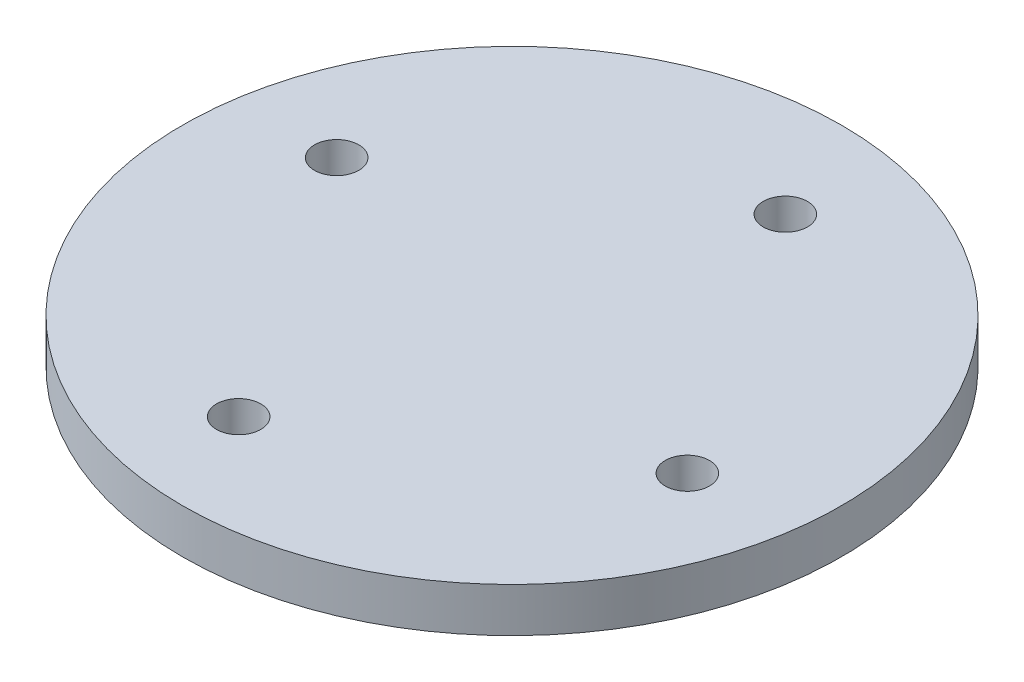
ISO-10303-21;
HEADER;
FILE_DESCRIPTION(('STEP AP214'),'2;1');
FILE_NAME('part.step','',(''),(''),'','','');
FILE_SCHEMA(('AUTOMOTIVE_DESIGN { 1 0 10303 214 1 1 1 1 }'));
ENDSEC;
DATA;
#1=APPLICATION_CONTEXT('core data for automotive mechanical design processes');
#2=APPLICATION_PROTOCOL_DEFINITION('international standard','automotive_design',2000,#1);
#3=PRODUCT_CONTEXT('',#1,'mechanical');
#4=PRODUCT('Part','Part','',(#3));
#5=PRODUCT_RELATED_PRODUCT_CATEGORY('part','',(#4));
#6=PRODUCT_DEFINITION_FORMATION('','',#4);
#7=PRODUCT_DEFINITION_CONTEXT('part definition',#1,'design');
#8=PRODUCT_DEFINITION('design','',#6,#7);
#9=PRODUCT_DEFINITION_SHAPE('','',#8);
#10=(LENGTH_UNIT() NAMED_UNIT(*) SI_UNIT(.MILLI.,.METRE.));
#11=(NAMED_UNIT(*) PLANE_ANGLE_UNIT() SI_UNIT($,.RADIAN.));
#12=(NAMED_UNIT(*) SI_UNIT($,.STERADIAN.) SOLID_ANGLE_UNIT());
#13=UNCERTAINTY_MEASURE_WITH_UNIT(LENGTH_MEASURE(1.E-05),#10,'distance_accuracy_value','');
#14=(GEOMETRIC_REPRESENTATION_CONTEXT(3) GLOBAL_UNCERTAINTY_ASSIGNED_CONTEXT((#13)) GLOBAL_UNIT_ASSIGNED_CONTEXT((#10,
#11,#12)) REPRESENTATION_CONTEXT('',''));
#15=CARTESIAN_POINT('',(0.,0.,0.));
#16=DIRECTION('',(0.,0.,1.));
#17=DIRECTION('',(1.,0.,0.));
#18=AXIS2_PLACEMENT_3D('',#15,#16,#17);
#19=CARTESIAN_POINT('',(-2.21163747918878,2.,10.1262966903329));
#20=DIRECTION('',(0.,-1.,0.));
#21=DIRECTION('',(0.,0.,-1.));
#22=AXIS2_PLACEMENT_3D('',#19,#20,#21);
#23=CYLINDRICAL_SURFACE('',#22,1.);
#24=CARTESIAN_POINT('',(-2.21163747918878,2.,10.1262966903329));
#25=DIRECTION('',(0.,1.,0.));
#26=DIRECTION('',(0.,0.,1.));
#27=AXIS2_PLACEMENT_3D('',#24,#25,#26);
#28=CIRCLE('',#27,1.);
#29=CARTESIAN_POINT('',(-2.21163747918878,2.,11.1262966903329));
#30=VERTEX_POINT('',#29);
#31=EDGE_CURVE('E54',#30,#30,#28,.T.);
#32=ORIENTED_EDGE('',*,*,#31,.T.);
#33=EDGE_LOOP('',(#32));
#34=FACE_BOUND('',#33,.T.);
#35=CARTESIAN_POINT('',(-2.21163747918878,0.,10.1262966903329));
#36=DIRECTION('',(0.,1.,0.));
#37=DIRECTION('',(0.,0.,1.));
#38=AXIS2_PLACEMENT_3D('',#35,#36,#37);
#39=CIRCLE('',#38,1.);
#40=CARTESIAN_POINT('',(-2.21163747918878,0.,11.1262966903329));
#41=VERTEX_POINT('',#40);
#42=EDGE_CURVE('E75',#41,#41,#39,.T.);
#43=ORIENTED_EDGE('',*,*,#42,.F.);
#44=EDGE_LOOP('',(#43));
#45=FACE_BOUND('',#44,.T.);
#46=ADVANCED_FACE('F45',(#34,#45),#23,.F.);
#47=CARTESIAN_POINT('',(10.1262966903329,2.,2.21163747918874));
#48=DIRECTION('',(0.,-1.,0.));
#49=DIRECTION('',(0.,0.,-1.));
#50=AXIS2_PLACEMENT_3D('',#47,#48,#49);
#51=CYLINDRICAL_SURFACE('',#50,1.);
#52=CARTESIAN_POINT('',(10.1262966903329,2.,2.21163747918874));
#53=DIRECTION('',(0.,1.,0.));
#54=DIRECTION('',(0.,0.,1.));
#55=AXIS2_PLACEMENT_3D('',#52,#53,#54);
#56=CIRCLE('',#55,1.);
#57=CARTESIAN_POINT('',(10.1262966903329,2.,3.21163747918874));
#58=VERTEX_POINT('',#57);
#59=EDGE_CURVE('E60',#58,#58,#56,.T.);
#60=ORIENTED_EDGE('',*,*,#59,.T.);
#61=EDGE_LOOP('',(#60));
#62=FACE_BOUND('',#61,.T.);
#63=CARTESIAN_POINT('',(10.1262966903329,0.,2.21163747918874));
#64=DIRECTION('',(0.,1.,0.));
#65=DIRECTION('',(0.,0.,1.));
#66=AXIS2_PLACEMENT_3D('',#63,#64,#65);
#67=CIRCLE('',#66,1.);
#68=CARTESIAN_POINT('',(10.1262966903329,0.,3.21163747918874));
#69=VERTEX_POINT('',#68);
#70=EDGE_CURVE('E72',#69,#69,#67,.T.);
#71=ORIENTED_EDGE('',*,*,#70,.F.);
#72=EDGE_LOOP('',(#71));
#73=FACE_BOUND('',#72,.T.);
#74=ADVANCED_FACE('F98',(#62,#73),#51,.F.);
#75=CARTESIAN_POINT('',(2.21163747918871,2.,-10.1262966903329));
#76=DIRECTION('',(0.,-1.,0.));
#77=DIRECTION('',(0.,0.,-1.));
#78=AXIS2_PLACEMENT_3D('',#75,#76,#77);
#79=CYLINDRICAL_SURFACE('',#78,1.);
#80=CARTESIAN_POINT('',(2.21163747918871,2.,-10.1262966903329));
#81=DIRECTION('',(0.,1.,0.));
#82=DIRECTION('',(0.,0.,1.));
#83=AXIS2_PLACEMENT_3D('',#80,#81,#82);
#84=CIRCLE('',#83,1.);
#85=CARTESIAN_POINT('',(2.21163747918871,2.,-9.12629669033294));
#86=VERTEX_POINT('',#85);
#87=EDGE_CURVE('E87',#86,#86,#84,.T.);
#88=ORIENTED_EDGE('',*,*,#87,.T.);
#89=EDGE_LOOP('',(#88));
#90=FACE_BOUND('',#89,.T.);
#91=CARTESIAN_POINT('',(2.21163747918871,0.,-10.1262966903329));
#92=DIRECTION('',(0.,1.,0.));
#93=DIRECTION('',(0.,0.,1.));
#94=AXIS2_PLACEMENT_3D('',#91,#92,#93);
#95=CIRCLE('',#94,1.);
#96=CARTESIAN_POINT('',(2.21163747918871,0.,-9.12629669033294));
#97=VERTEX_POINT('',#96);
#98=EDGE_CURVE('E68',#97,#97,#95,.T.);
#99=ORIENTED_EDGE('',*,*,#98,.F.);
#100=EDGE_LOOP('',(#99));
#101=FACE_BOUND('',#100,.T.);
#102=ADVANCED_FACE('F116',(#90,#101),#79,.F.);
#103=CARTESIAN_POINT('',(-10.1262966903329,2.,-2.21163747918881));
#104=DIRECTION('',(0.,-1.,0.));
#105=DIRECTION('',(0.,0.,-1.));
#106=AXIS2_PLACEMENT_3D('',#103,#104,#105);
#107=CYLINDRICAL_SURFACE('',#106,1.);
#108=CARTESIAN_POINT('',(-10.1262966903329,2.,-2.21163747918881));
#109=DIRECTION('',(0.,1.,0.));
#110=DIRECTION('',(0.,0.,1.));
#111=AXIS2_PLACEMENT_3D('',#108,#109,#110);
#112=CIRCLE('',#111,1.);
#113=CARTESIAN_POINT('',(-10.1262966903329,2.,-1.21163747918881));
#114=VERTEX_POINT('',#113);
#115=EDGE_CURVE('E82',#114,#114,#112,.T.);
#116=ORIENTED_EDGE('',*,*,#115,.T.);
#117=EDGE_LOOP('',(#116));
#118=FACE_BOUND('',#117,.T.);
#119=CARTESIAN_POINT('',(-10.1262966903329,0.,-2.21163747918881));
#120=DIRECTION('',(0.,1.,0.));
#121=DIRECTION('',(0.,0.,1.));
#122=AXIS2_PLACEMENT_3D('',#119,#120,#121);
#123=CIRCLE('',#122,1.);
#124=CARTESIAN_POINT('',(-10.1262966903329,0.,-1.21163747918881));
#125=VERTEX_POINT('',#124);
#126=EDGE_CURVE('E64',#125,#125,#123,.T.);
#127=ORIENTED_EDGE('',*,*,#126,.F.);
#128=EDGE_LOOP('',(#127));
#129=FACE_BOUND('',#128,.T.);
#130=ADVANCED_FACE('F47',(#118,#129),#107,.F.);
#131=CARTESIAN_POINT('',(0.,2.,0.));
#132=DIRECTION('',(0.,-1.,0.));
#133=DIRECTION('',(0.,0.,-1.));
#134=AXIS2_PLACEMENT_3D('',#131,#132,#133);
#135=CYLINDRICAL_SURFACE('',#134,14.875);
#136=CARTESIAN_POINT('',(0.,2.,0.));
#137=DIRECTION('',(0.,1.,0.));
#138=DIRECTION('',(0.,0.,1.));
#139=AXIS2_PLACEMENT_3D('',#136,#137,#138);
#140=CIRCLE('',#139,14.875);
#141=CARTESIAN_POINT('',(0.,2.,14.875));
#142=VERTEX_POINT('',#141);
#143=EDGE_CURVE('E10',#142,#142,#140,.T.);
#144=ORIENTED_EDGE('',*,*,#143,.F.);
#145=EDGE_LOOP('',(#144));
#146=FACE_BOUND('',#145,.T.);
#147=CARTESIAN_POINT('',(0.,0.,0.));
#148=DIRECTION('',(0.,1.,0.));
#149=DIRECTION('',(0.,0.,1.));
#150=AXIS2_PLACEMENT_3D('',#147,#148,#149);
#151=CIRCLE('',#150,14.875);
#152=CARTESIAN_POINT('',(0.,0.,14.875));
#153=VERTEX_POINT('',#152);
#154=EDGE_CURVE('E49',#153,#153,#151,.T.);
#155=ORIENTED_EDGE('',*,*,#154,.T.);
#156=EDGE_LOOP('',(#155));
#157=FACE_BOUND('',#156,.T.);
#158=ADVANCED_FACE('F105',(#146,#157),#135,.T.);
#159=CARTESIAN_POINT('',(0.,2.,0.));
#160=DIRECTION('',(0.,1.,0.));
#161=DIRECTION('',(0.,0.,1.));
#162=AXIS2_PLACEMENT_3D('',#159,#160,#161);
#163=PLANE('',#162);
#164=ORIENTED_EDGE('',*,*,#115,.F.);
#165=EDGE_LOOP('',(#164));
#166=FACE_BOUND('',#165,.T.);
#167=ORIENTED_EDGE('',*,*,#87,.F.);
#168=EDGE_LOOP('',(#167));
#169=FACE_BOUND('',#168,.T.);
#170=ORIENTED_EDGE('',*,*,#59,.F.);
#171=EDGE_LOOP('',(#170));
#172=FACE_BOUND('',#171,.T.);
#173=ORIENTED_EDGE('',*,*,#31,.F.);
#174=EDGE_LOOP('',(#173));
#175=FACE_BOUND('',#174,.T.);
#176=ORIENTED_EDGE('',*,*,#143,.T.);
#177=EDGE_LOOP('',(#176));
#178=FACE_BOUND('',#177,.T.);
#179=ADVANCED_FACE('F101',(#166,#169,#172,#175,#178),#163,.T.);
#180=CARTESIAN_POINT('',(0.,0.,0.));
#181=DIRECTION('',(0.,1.,0.));
#182=DIRECTION('',(0.,0.,1.));
#183=AXIS2_PLACEMENT_3D('',#180,#181,#182);
#184=PLANE('',#183);
#185=ORIENTED_EDGE('',*,*,#126,.T.);
#186=EDGE_LOOP('',(#185));
#187=FACE_BOUND('',#186,.T.);
#188=ORIENTED_EDGE('',*,*,#98,.T.);
#189=EDGE_LOOP('',(#188));
#190=FACE_BOUND('',#189,.T.);
#191=ORIENTED_EDGE('',*,*,#70,.T.);
#192=EDGE_LOOP('',(#191));
#193=FACE_BOUND('',#192,.T.);
#194=ORIENTED_EDGE('',*,*,#42,.T.);
#195=EDGE_LOOP('',(#194));
#196=FACE_BOUND('',#195,.T.);
#197=ORIENTED_EDGE('',*,*,#154,.F.);
#198=EDGE_LOOP('',(#197));
#199=FACE_BOUND('',#198,.T.);
#200=ADVANCED_FACE('F104',(#187,#190,#193,#196,#199),#184,.F.);
#201=CLOSED_SHELL('',(#46,#74,#102,#130,#158,#179,#200));
#202=MANIFOLD_SOLID_BREP('B2',#201);
#203=ADVANCED_BREP_SHAPE_REPRESENTATION('',(#18,#202),#14);
#204=SHAPE_DEFINITION_REPRESENTATION(#9,#203);
ENDSEC;
END-ISO-10303-21;
